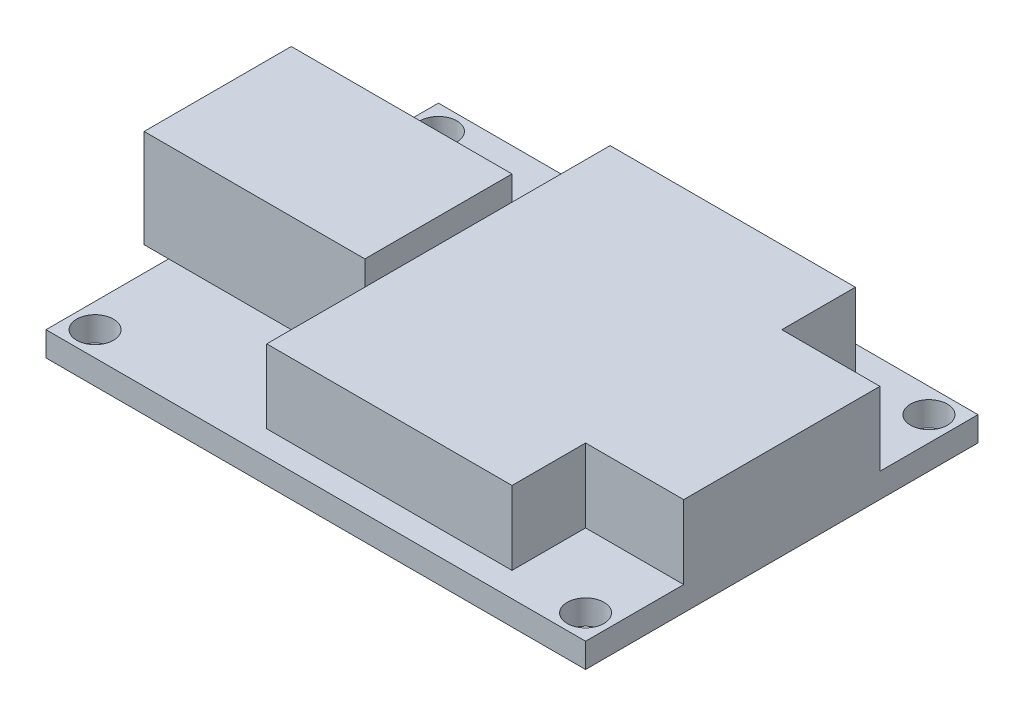
ISO-10303-21;
HEADER;
FILE_DESCRIPTION(('STEP AP214'),'2;1');
FILE_NAME('part.step','',(''),(''),'','','');
FILE_SCHEMA(('AUTOMOTIVE_DESIGN { 1 0 10303 214 1 1 1 1 }'));
ENDSEC;
DATA;
#1=APPLICATION_CONTEXT('core data for automotive mechanical design processes');
#2=APPLICATION_PROTOCOL_DEFINITION('international standard','automotive_design',2000,#1);
#3=PRODUCT_CONTEXT('',#1,'mechanical');
#4=PRODUCT('Part','Part','',(#3));
#5=PRODUCT_RELATED_PRODUCT_CATEGORY('part','',(#4));
#6=PRODUCT_DEFINITION_FORMATION('','',#4);
#7=PRODUCT_DEFINITION_CONTEXT('part definition',#1,'design');
#8=PRODUCT_DEFINITION('design','',#6,#7);
#9=PRODUCT_DEFINITION_SHAPE('','',#8);
#10=(LENGTH_UNIT() NAMED_UNIT(*) SI_UNIT(.MILLI.,.METRE.));
#11=(NAMED_UNIT(*) PLANE_ANGLE_UNIT() SI_UNIT($,.RADIAN.));
#12=(NAMED_UNIT(*) SI_UNIT($,.STERADIAN.) SOLID_ANGLE_UNIT());
#13=UNCERTAINTY_MEASURE_WITH_UNIT(LENGTH_MEASURE(1.E-05),#10,'distance_accuracy_value','');
#14=(GEOMETRIC_REPRESENTATION_CONTEXT(3) GLOBAL_UNCERTAINTY_ASSIGNED_CONTEXT((#13)) GLOBAL_UNIT_ASSIGNED_CONTEXT((#10,
#11,#12)) REPRESENTATION_CONTEXT('',''));
#15=CARTESIAN_POINT('',(0.,0.,0.));
#16=DIRECTION('',(0.,0.,1.));
#17=DIRECTION('',(1.,0.,0.));
#18=AXIS2_PLACEMENT_3D('',#15,#16,#17);
#19=CARTESIAN_POINT('',(0.,1.5875,0.));
#20=DIRECTION('',(0.,1.,0.));
#21=DIRECTION('',(0.,0.,1.));
#22=AXIS2_PLACEMENT_3D('',#19,#20,#21);
#23=PLANE('',#22);
#24=CARTESIAN_POINT('',(15.875,1.5875,11.1125));
#25=DIRECTION('',(0.,1.,0.));
#26=DIRECTION('',(0.,0.,1.));
#27=AXIS2_PLACEMENT_3D('',#24,#25,#26);
#28=CIRCLE('',#27,1.190625);
#29=CARTESIAN_POINT('',(15.875,1.5875,12.303125));
#30=VERTEX_POINT('',#29);
#31=EDGE_CURVE('E373',#30,#30,#28,.T.);
#32=ORIENTED_EDGE('',*,*,#31,.F.);
#33=EDGE_LOOP('',(#32));
#34=FACE_BOUND('',#33,.T.);
#35=CARTESIAN_POINT('',(-15.875,1.5875,11.1125));
#36=DIRECTION('',(0.,1.,0.));
#37=DIRECTION('',(0.,0.,1.));
#38=AXIS2_PLACEMENT_3D('',#35,#36,#37);
#39=CIRCLE('',#38,1.190625);
#40=CARTESIAN_POINT('',(-15.875,1.5875,12.303125));
#41=VERTEX_POINT('',#40);
#42=EDGE_CURVE('E379',#41,#41,#39,.T.);
#43=ORIENTED_EDGE('',*,*,#42,.F.);
#44=EDGE_LOOP('',(#43));
#45=FACE_BOUND('',#44,.T.);
#46=DIRECTION('',(0.,0.,1.));
#47=VECTOR('',#46,1.);
#48=CARTESIAN_POINT('',(-4.76250000000001,1.5875,-11.1125));
#49=LINE('',#48,#47);
#50=CARTESIAN_POINT('',(-4.76250000000001,1.5875,4.7625));
#51=VERTEX_POINT('',#50);
#52=CARTESIAN_POINT('',(-4.7625,1.5875,11.1125));
#53=VERTEX_POINT('',#52);
#54=EDGE_CURVE('E186',#51,#53,#49,.T.);
#55=ORIENTED_EDGE('',*,*,#54,.F.);
#56=DIRECTION('',(1.,0.,0.));
#57=VECTOR('',#56,1.);
#58=CARTESIAN_POINT('',(-19.05,1.5875,4.7625));
#59=LINE('',#58,#57);
#60=CARTESIAN_POINT('',(-17.4625,1.5875,4.7625));
#61=VERTEX_POINT('',#60);
#62=EDGE_CURVE('E322',#61,#51,#59,.T.);
#63=ORIENTED_EDGE('',*,*,#62,.F.);
#64=DIRECTION('',(0.,0.,1.));
#65=VECTOR('',#64,1.);
#66=CARTESIAN_POINT('',(-17.4625,1.5875,-12.7));
#67=LINE('',#66,#65);
#68=CARTESIAN_POINT('',(-17.4625,1.5875,12.7));
#69=VERTEX_POINT('',#68);
#70=EDGE_CURVE('E259',#61,#69,#67,.T.);
#71=ORIENTED_EDGE('',*,*,#70,.T.);
#72=DIRECTION('',(1.,0.,0.));
#73=VECTOR('',#72,1.);
#74=CARTESIAN_POINT('',(-17.4625,1.5875,12.7));
#75=LINE('',#74,#73);
#76=CARTESIAN_POINT('',(17.4625,1.5875,12.7));
#77=VERTEX_POINT('',#76);
#78=EDGE_CURVE('E263',#69,#77,#75,.T.);
#79=ORIENTED_EDGE('',*,*,#78,.T.);
#80=DIRECTION('',(0.,0.,-1.));
#81=VECTOR('',#80,1.);
#82=CARTESIAN_POINT('',(17.4625,1.5875,-12.7));
#83=LINE('',#82,#81);
#84=CARTESIAN_POINT('',(17.4625,1.5875,6.34999999999999));
#85=VERTEX_POINT('',#84);
#86=EDGE_CURVE('E254',#77,#85,#83,.T.);
#87=ORIENTED_EDGE('',*,*,#86,.T.);
#88=DIRECTION('',(1.,0.,0.));
#89=VECTOR('',#88,1.);
#90=CARTESIAN_POINT('',(11.1125,1.5875,6.35));
#91=LINE('',#90,#89);
#92=CARTESIAN_POINT('',(11.1125,1.5875,6.35));
#93=VERTEX_POINT('',#92);
#94=EDGE_CURVE('E221',#93,#85,#91,.T.);
#95=ORIENTED_EDGE('',*,*,#94,.F.);
#96=DIRECTION('',(0.,0.,-1.));
#97=VECTOR('',#96,1.);
#98=CARTESIAN_POINT('',(11.1125,1.5875,6.35));
#99=LINE('',#98,#97);
#100=CARTESIAN_POINT('',(11.1125,1.5875,11.1125));
#101=VERTEX_POINT('',#100);
#102=EDGE_CURVE('E218',#101,#93,#99,.T.);
#103=ORIENTED_EDGE('',*,*,#102,.F.);
#104=DIRECTION('',(1.,0.,0.));
#105=VECTOR('',#104,1.);
#106=CARTESIAN_POINT('',(-4.7625,1.5875,11.1125));
#107=LINE('',#106,#105);
#108=EDGE_CURVE('E215',#53,#101,#107,.T.);
#109=ORIENTED_EDGE('',*,*,#108,.F.);
#110=EDGE_LOOP('',(#55,#63,#71,#79,#87,#95,#103,#109));
#111=FACE_BOUND('',#110,.T.);
#112=ADVANCED_FACE('F36',(#34,#45,#111),#23,.T.);
#113=CARTESIAN_POINT('',(15.875,1.5875,-11.1125));
#114=DIRECTION('',(0.,1.,0.));
#115=DIRECTION('',(0.,0.,1.));
#116=AXIS2_PLACEMENT_3D('',#113,#114,#115);
#117=CIRCLE('',#116,1.190625);
#118=CARTESIAN_POINT('',(15.875,1.5875,-9.921875));
#119=VERTEX_POINT('',#118);
#120=EDGE_CURVE('E367',#119,#119,#117,.T.);
#121=ORIENTED_EDGE('',*,*,#120,.F.);
#122=EDGE_LOOP('',(#121));
#123=FACE_BOUND('',#122,.T.);
#124=CARTESIAN_POINT('',(-15.875,1.5875,-11.1125));
#125=DIRECTION('',(0.,1.,0.));
#126=DIRECTION('',(0.,0.,1.));
#127=AXIS2_PLACEMENT_3D('',#124,#125,#126);
#128=CIRCLE('',#127,1.190625);
#129=CARTESIAN_POINT('',(-15.875,1.5875,-9.921875));
#130=VERTEX_POINT('',#129);
#131=EDGE_CURVE('E361',#130,#130,#128,.T.);
#132=ORIENTED_EDGE('',*,*,#131,.F.);
#133=EDGE_LOOP('',(#132));
#134=FACE_BOUND('',#133,.T.);
#135=CARTESIAN_POINT('',(-17.4625,1.5875,-12.7));
#136=VERTEX_POINT('',#135);
#137=CARTESIAN_POINT('',(-17.4625,1.5875,-4.7625));
#138=VERTEX_POINT('',#137);
#139=EDGE_CURVE('E260',#136,#138,#67,.T.);
#140=ORIENTED_EDGE('',*,*,#139,.T.);
#141=DIRECTION('',(-1.,0.,0.));
#142=VECTOR('',#141,1.);
#143=CARTESIAN_POINT('',(-19.05,1.5875,-4.7625));
#144=LINE('',#143,#142);
#145=CARTESIAN_POINT('',(-4.76250000000001,1.5875,-4.7625));
#146=VERTEX_POINT('',#145);
#147=EDGE_CURVE('E179',#146,#138,#144,.T.);
#148=ORIENTED_EDGE('',*,*,#147,.F.);
#149=CARTESIAN_POINT('',(-4.76250000000001,1.5875,-11.1125));
#150=VERTEX_POINT('',#149);
#151=EDGE_CURVE('E212',#150,#146,#49,.T.);
#152=ORIENTED_EDGE('',*,*,#151,.F.);
#153=DIRECTION('',(-1.,0.,0.));
#154=VECTOR('',#153,1.);
#155=CARTESIAN_POINT('',(-4.76250000000001,1.5875,-11.1125));
#156=LINE('',#155,#154);
#157=CARTESIAN_POINT('',(11.1125,1.5875,-11.1125));
#158=VERTEX_POINT('',#157);
#159=EDGE_CURVE('E227',#158,#150,#156,.T.);
#160=ORIENTED_EDGE('',*,*,#159,.F.);
#161=DIRECTION('',(0.,0.,-1.));
#162=VECTOR('',#161,1.);
#163=CARTESIAN_POINT('',(11.1125,1.5875,-11.1125));
#164=LINE('',#163,#162);
#165=CARTESIAN_POINT('',(11.1125,1.5875,-6.35));
#166=VERTEX_POINT('',#165);
#167=EDGE_CURVE('E59',#166,#158,#164,.T.);
#168=ORIENTED_EDGE('',*,*,#167,.F.);
#169=DIRECTION('',(-1.,0.,0.));
#170=VECTOR('',#169,1.);
#171=CARTESIAN_POINT('',(11.1125,1.5875,-6.35));
#172=LINE('',#171,#170);
#173=CARTESIAN_POINT('',(17.4625,1.5875,-6.35));
#174=VERTEX_POINT('',#173);
#175=EDGE_CURVE('E224',#174,#166,#172,.T.);
#176=ORIENTED_EDGE('',*,*,#175,.F.);
#177=CARTESIAN_POINT('',(17.4625,1.5875,-12.7));
#178=VERTEX_POINT('',#177);
#179=EDGE_CURVE('E257',#174,#178,#83,.T.);
#180=ORIENTED_EDGE('',*,*,#179,.T.);
#181=DIRECTION('',(-1.,0.,0.));
#182=VECTOR('',#181,1.);
#183=CARTESIAN_POINT('',(-17.4625,1.5875,-12.7));
#184=LINE('',#183,#182);
#185=EDGE_CURVE('E256',#178,#136,#184,.T.);
#186=ORIENTED_EDGE('',*,*,#185,.T.);
#187=EDGE_LOOP('',(#140,#148,#152,#160,#168,#176,#180,#186));
#188=FACE_BOUND('',#187,.T.);
#189=ADVANCED_FACE('F328',(#123,#134,#188),#23,.T.);
#190=CARTESIAN_POINT('',(-4.76250000000001,6.35,-11.1125));
#191=DIRECTION('',(1.,0.,0.));
#192=DIRECTION('',(0.,0.,-1.));
#193=AXIS2_PLACEMENT_3D('',#190,#191,#192);
#194=PLANE('',#193);
#195=DIRECTION('',(0.,-1.,0.));
#196=VECTOR('',#195,1.);
#197=CARTESIAN_POINT('',(-4.76250000000001,7.9375,4.7625));
#198=LINE('',#197,#196);
#199=CARTESIAN_POINT('',(-4.7625,6.35,4.7625));
#200=VERTEX_POINT('',#199);
#201=EDGE_CURVE('E188',#200,#51,#198,.T.);
#202=ORIENTED_EDGE('',*,*,#201,.T.);
#203=ORIENTED_EDGE('',*,*,#54,.T.);
#204=DIRECTION('',(0.,-1.,0.));
#205=VECTOR('',#204,1.);
#206=CARTESIAN_POINT('',(-4.7625,6.35,11.1125));
#207=LINE('',#206,#205);
#208=CARTESIAN_POINT('',(-4.7625,6.35,11.1125));
#209=VERTEX_POINT('',#208);
#210=EDGE_CURVE('E250',#209,#53,#207,.T.);
#211=ORIENTED_EDGE('',*,*,#210,.F.);
#212=DIRECTION('',(0.,0.,1.));
#213=VECTOR('',#212,1.);
#214=CARTESIAN_POINT('',(-4.76250000000001,6.35,-11.1125));
#215=LINE('',#214,#213);
#216=EDGE_CURVE('E197',#200,#209,#215,.T.);
#217=ORIENTED_EDGE('',*,*,#216,.F.);
#218=EDGE_LOOP('',(#202,#203,#211,#217));
#219=FACE_BOUND('',#218,.T.);
#220=ADVANCED_FACE('F319',(#219),#194,.F.);
#221=DIRECTION('',(0.,-1.,0.));
#222=VECTOR('',#221,1.);
#223=CARTESIAN_POINT('',(-4.76250000000001,7.9375,-4.7625));
#224=LINE('',#223,#222);
#225=CARTESIAN_POINT('',(-4.76250000000001,6.35,-4.7625));
#226=VERTEX_POINT('',#225);
#227=EDGE_CURVE('E349',#226,#146,#224,.T.);
#228=ORIENTED_EDGE('',*,*,#227,.F.);
#229=CARTESIAN_POINT('',(-4.76250000000001,6.35,-11.1125));
#230=VERTEX_POINT('',#229);
#231=EDGE_CURVE('E192',#230,#226,#215,.T.);
#232=ORIENTED_EDGE('',*,*,#231,.F.);
#233=DIRECTION('',(0.,-1.,0.));
#234=VECTOR('',#233,1.);
#235=CARTESIAN_POINT('',(-4.76250000000001,6.35,-11.1125));
#236=LINE('',#235,#234);
#237=EDGE_CURVE('E211',#230,#150,#236,.T.);
#238=ORIENTED_EDGE('',*,*,#237,.T.);
#239=ORIENTED_EDGE('',*,*,#151,.T.);
#240=EDGE_LOOP('',(#228,#232,#238,#239));
#241=FACE_BOUND('',#240,.T.);
#242=ADVANCED_FACE('F351',(#241),#194,.F.);
#243=CARTESIAN_POINT('',(17.4625,1.5875,-12.7));
#244=DIRECTION('',(-1.,0.,0.));
#245=DIRECTION('',(0.,0.,1.));
#246=AXIS2_PLACEMENT_3D('',#243,#244,#245);
#247=PLANE('',#246);
#248=DIRECTION('',(0.,0.,-1.));
#249=VECTOR('',#248,1.);
#250=CARTESIAN_POINT('',(17.4625,0.,-12.7));
#251=LINE('',#250,#249);
#252=CARTESIAN_POINT('',(17.4625,0.,12.7));
#253=VERTEX_POINT('',#252);
#254=CARTESIAN_POINT('',(17.4625,0.,-12.7));
#255=VERTEX_POINT('',#254);
#256=EDGE_CURVE('E253',#253,#255,#251,.T.);
#257=ORIENTED_EDGE('',*,*,#256,.T.);
#258=DIRECTION('',(0.,-1.,0.));
#259=VECTOR('',#258,1.);
#260=CARTESIAN_POINT('',(17.4625,1.5875,-12.7));
#261=LINE('',#260,#259);
#262=EDGE_CURVE('E11',#178,#255,#261,.T.);
#263=ORIENTED_EDGE('',*,*,#262,.F.);
#264=ORIENTED_EDGE('',*,*,#179,.F.);
#265=DIRECTION('',(0.,-1.,0.));
#266=VECTOR('',#265,1.);
#267=CARTESIAN_POINT('',(17.4625,6.35,-6.35));
#268=LINE('',#267,#266);
#269=CARTESIAN_POINT('',(17.4625,6.35,-6.35));
#270=VERTEX_POINT('',#269);
#271=EDGE_CURVE('E238',#270,#174,#268,.T.);
#272=ORIENTED_EDGE('',*,*,#271,.F.);
#273=DIRECTION('',(0.,0.,-1.));
#274=VECTOR('',#273,1.);
#275=CARTESIAN_POINT('',(17.4625,6.35,-6.35));
#276=LINE('',#275,#274);
#277=CARTESIAN_POINT('',(17.4625,6.35,6.35));
#278=VERTEX_POINT('',#277);
#279=EDGE_CURVE('E203',#278,#270,#276,.T.);
#280=ORIENTED_EDGE('',*,*,#279,.F.);
#281=DIRECTION('',(0.,-1.,0.));
#282=VECTOR('',#281,1.);
#283=CARTESIAN_POINT('',(17.4625,6.35,6.35));
#284=LINE('',#283,#282);
#285=EDGE_CURVE('E241',#278,#85,#284,.T.);
#286=ORIENTED_EDGE('',*,*,#285,.T.);
#287=ORIENTED_EDGE('',*,*,#86,.F.);
#288=DIRECTION('',(0.,-1.,0.));
#289=VECTOR('',#288,1.);
#290=CARTESIAN_POINT('',(17.4625,1.5875,12.7));
#291=LINE('',#290,#289);
#292=EDGE_CURVE('E265',#77,#253,#291,.T.);
#293=ORIENTED_EDGE('',*,*,#292,.T.);
#294=EDGE_LOOP('',(#257,#263,#264,#272,#280,#286,#287,#293));
#295=FACE_BOUND('',#294,.T.);
#296=ADVANCED_FACE('F38',(#295),#247,.F.);
#297=CARTESIAN_POINT('',(-17.4625,1.5875,-12.7));
#298=DIRECTION('',(0.,0.,1.));
#299=DIRECTION('',(1.,0.,0.));
#300=AXIS2_PLACEMENT_3D('',#297,#298,#299);
#301=PLANE('',#300);
#302=DIRECTION('',(-1.,0.,0.));
#303=VECTOR('',#302,1.);
#304=CARTESIAN_POINT('',(-17.4625,0.,-12.7));
#305=LINE('',#304,#303);
#306=CARTESIAN_POINT('',(-17.4625,0.,-12.7));
#307=VERTEX_POINT('',#306);
#308=EDGE_CURVE('E268',#255,#307,#305,.T.);
#309=ORIENTED_EDGE('',*,*,#308,.T.);
#310=DIRECTION('',(0.,-1.,0.));
#311=VECTOR('',#310,1.);
#312=CARTESIAN_POINT('',(-17.4625,1.5875,-12.7));
#313=LINE('',#312,#311);
#314=EDGE_CURVE('E44',#136,#307,#313,.T.);
#315=ORIENTED_EDGE('',*,*,#314,.F.);
#316=ORIENTED_EDGE('',*,*,#185,.F.);
#317=ORIENTED_EDGE('',*,*,#262,.T.);
#318=EDGE_LOOP('',(#309,#315,#316,#317));
#319=FACE_BOUND('',#318,.T.);
#320=ADVANCED_FACE('F331',(#319),#301,.F.);
#321=CARTESIAN_POINT('',(-17.4625,1.5875,-12.7));
#322=DIRECTION('',(1.,0.,0.));
#323=DIRECTION('',(0.,0.,-1.));
#324=AXIS2_PLACEMENT_3D('',#321,#322,#323);
#325=PLANE('',#324);
#326=DIRECTION('',(0.,0.,1.));
#327=VECTOR('',#326,1.);
#328=CARTESIAN_POINT('',(-17.4625,0.,-12.7));
#329=LINE('',#328,#327);
#330=CARTESIAN_POINT('',(-17.4625,0.,12.7));
#331=VERTEX_POINT('',#330);
#332=EDGE_CURVE('E270',#307,#331,#329,.T.);
#333=ORIENTED_EDGE('',*,*,#332,.T.);
#334=DIRECTION('',(0.,-1.,0.));
#335=VECTOR('',#334,1.);
#336=CARTESIAN_POINT('',(-17.4625,1.5875,12.7));
#337=LINE('',#336,#335);
#338=EDGE_CURVE('E276',#69,#331,#337,.T.);
#339=ORIENTED_EDGE('',*,*,#338,.F.);
#340=ORIENTED_EDGE('',*,*,#70,.F.);
#341=DIRECTION('',(0.,0.,1.));
#342=VECTOR('',#341,1.);
#343=CARTESIAN_POINT('',(-17.4625,1.5875,-12.7));
#344=LINE('',#343,#342);
#345=EDGE_CURVE('E184',#138,#61,#344,.T.);
#346=ORIENTED_EDGE('',*,*,#345,.F.);
#347=ORIENTED_EDGE('',*,*,#139,.F.);
#348=ORIENTED_EDGE('',*,*,#314,.T.);
#349=EDGE_LOOP('',(#333,#339,#340,#346,#347,#348));
#350=FACE_BOUND('',#349,.T.);
#351=ADVANCED_FACE('F283',(#350),#325,.F.);
#352=CARTESIAN_POINT('',(-17.4625,1.5875,12.7));
#353=DIRECTION('',(0.,0.,-1.));
#354=DIRECTION('',(-1.,0.,0.));
#355=AXIS2_PLACEMENT_3D('',#352,#353,#354);
#356=PLANE('',#355);
#357=DIRECTION('',(1.,0.,0.));
#358=VECTOR('',#357,1.);
#359=CARTESIAN_POINT('',(-17.4625,0.,12.7));
#360=LINE('',#359,#358);
#361=EDGE_CURVE('E272',#331,#253,#360,.T.);
#362=ORIENTED_EDGE('',*,*,#361,.T.);
#363=ORIENTED_EDGE('',*,*,#292,.F.);
#364=ORIENTED_EDGE('',*,*,#78,.F.);
#365=ORIENTED_EDGE('',*,*,#338,.T.);
#366=EDGE_LOOP('',(#362,#363,#364,#365));
#367=FACE_BOUND('',#366,.T.);
#368=ADVANCED_FACE('F294',(#367),#356,.F.);
#369=CARTESIAN_POINT('',(0.,0.,0.));
#370=DIRECTION('',(0.,1.,0.));
#371=DIRECTION('',(0.,0.,1.));
#372=AXIS2_PLACEMENT_3D('',#369,#370,#371);
#373=PLANE('',#372);
#374=CARTESIAN_POINT('',(15.875,0.,-11.1125));
#375=DIRECTION('',(0.,1.,0.));
#376=DIRECTION('',(0.,0.,1.));
#377=AXIS2_PLACEMENT_3D('',#374,#375,#376);
#378=CIRCLE('',#377,1.190625);
#379=CARTESIAN_POINT('',(15.875,0.,-9.921875));
#380=VERTEX_POINT('',#379);
#381=EDGE_CURVE('E370',#380,#380,#378,.T.);
#382=ORIENTED_EDGE('',*,*,#381,.T.);
#383=EDGE_LOOP('',(#382));
#384=FACE_BOUND('',#383,.T.);
#385=CARTESIAN_POINT('',(15.875,0.,11.1125));
#386=DIRECTION('',(0.,1.,0.));
#387=DIRECTION('',(0.,0.,1.));
#388=AXIS2_PLACEMENT_3D('',#385,#386,#387);
#389=CIRCLE('',#388,1.190625);
#390=CARTESIAN_POINT('',(15.875,0.,12.303125));
#391=VERTEX_POINT('',#390);
#392=EDGE_CURVE('E376',#391,#391,#389,.T.);
#393=ORIENTED_EDGE('',*,*,#392,.T.);
#394=EDGE_LOOP('',(#393));
#395=FACE_BOUND('',#394,.T.);
#396=CARTESIAN_POINT('',(-15.875,0.,11.1125));
#397=DIRECTION('',(0.,1.,0.));
#398=DIRECTION('',(0.,0.,1.));
#399=AXIS2_PLACEMENT_3D('',#396,#397,#398);
#400=CIRCLE('',#399,1.190625);
#401=CARTESIAN_POINT('',(-15.875,0.,12.303125));
#402=VERTEX_POINT('',#401);
#403=EDGE_CURVE('E364',#402,#402,#400,.T.);
#404=ORIENTED_EDGE('',*,*,#403,.T.);
#405=EDGE_LOOP('',(#404));
#406=FACE_BOUND('',#405,.T.);
#407=CARTESIAN_POINT('',(-15.875,0.,-11.1125));
#408=DIRECTION('',(0.,1.,0.));
#409=DIRECTION('',(0.,0.,1.));
#410=AXIS2_PLACEMENT_3D('',#407,#408,#409);
#411=CIRCLE('',#410,1.190625);
#412=CARTESIAN_POINT('',(-15.875,0.,-9.921875));
#413=VERTEX_POINT('',#412);
#414=EDGE_CURVE('E358',#413,#413,#411,.T.);
#415=ORIENTED_EDGE('',*,*,#414,.T.);
#416=EDGE_LOOP('',(#415));
#417=FACE_BOUND('',#416,.T.);
#418=ORIENTED_EDGE('',*,*,#256,.F.);
#419=ORIENTED_EDGE('',*,*,#361,.F.);
#420=ORIENTED_EDGE('',*,*,#332,.F.);
#421=ORIENTED_EDGE('',*,*,#308,.F.);
#422=EDGE_LOOP('',(#418,#419,#420,#421));
#423=FACE_BOUND('',#422,.T.);
#424=ADVANCED_FACE('F291',(#384,#395,#406,#417,#423),#373,.F.);
#425=CARTESIAN_POINT('',(-4.7625,6.35,11.1125));
#426=DIRECTION('',(0.,0.,-1.));
#427=DIRECTION('',(-1.,0.,0.));
#428=AXIS2_PLACEMENT_3D('',#425,#426,#427);
#429=PLANE('',#428);
#430=ORIENTED_EDGE('',*,*,#108,.T.);
#431=DIRECTION('',(0.,-1.,0.));
#432=VECTOR('',#431,1.);
#433=CARTESIAN_POINT('',(11.1125,6.35,11.1125));
#434=LINE('',#433,#432);
#435=CARTESIAN_POINT('',(11.1125,6.35,11.1125));
#436=VERTEX_POINT('',#435);
#437=EDGE_CURVE('E247',#436,#101,#434,.T.);
#438=ORIENTED_EDGE('',*,*,#437,.F.);
#439=DIRECTION('',(1.,0.,0.));
#440=VECTOR('',#439,1.);
#441=CARTESIAN_POINT('',(-4.7625,6.35,11.1125));
#442=LINE('',#441,#440);
#443=EDGE_CURVE('E195',#209,#436,#442,.T.);
#444=ORIENTED_EDGE('',*,*,#443,.F.);
#445=ORIENTED_EDGE('',*,*,#210,.T.);
#446=EDGE_LOOP('',(#430,#438,#444,#445));
#447=FACE_BOUND('',#446,.T.);
#448=ADVANCED_FACE('F313',(#447),#429,.F.);
#449=CARTESIAN_POINT('',(11.1125,6.35,6.35));
#450=DIRECTION('',(-1.,0.,0.));
#451=DIRECTION('',(0.,0.,1.));
#452=AXIS2_PLACEMENT_3D('',#449,#450,#451);
#453=PLANE('',#452);
#454=ORIENTED_EDGE('',*,*,#102,.T.);
#455=DIRECTION('',(0.,-1.,0.));
#456=VECTOR('',#455,1.);
#457=CARTESIAN_POINT('',(11.1125,6.35,6.35));
#458=LINE('',#457,#456);
#459=CARTESIAN_POINT('',(11.1125,6.35,6.35));
#460=VERTEX_POINT('',#459);
#461=EDGE_CURVE('E244',#460,#93,#458,.T.);
#462=ORIENTED_EDGE('',*,*,#461,.F.);
#463=DIRECTION('',(0.,0.,-1.));
#464=VECTOR('',#463,1.);
#465=CARTESIAN_POINT('',(11.1125,6.35,6.35));
#466=LINE('',#465,#464);
#467=EDGE_CURVE('E199',#436,#460,#466,.T.);
#468=ORIENTED_EDGE('',*,*,#467,.F.);
#469=ORIENTED_EDGE('',*,*,#437,.T.);
#470=EDGE_LOOP('',(#454,#462,#468,#469));
#471=FACE_BOUND('',#470,.T.);
#472=ADVANCED_FACE('F309',(#471),#453,.F.);
#473=CARTESIAN_POINT('',(11.1125,6.35,6.35));
#474=DIRECTION('',(0.,0.,-1.));
#475=DIRECTION('',(-1.,0.,0.));
#476=AXIS2_PLACEMENT_3D('',#473,#474,#475);
#477=PLANE('',#476);
#478=ORIENTED_EDGE('',*,*,#94,.T.);
#479=ORIENTED_EDGE('',*,*,#285,.F.);
#480=DIRECTION('',(1.,0.,0.));
#481=VECTOR('',#480,1.);
#482=CARTESIAN_POINT('',(11.1125,6.35,6.35));
#483=LINE('',#482,#481);
#484=EDGE_CURVE('E201',#460,#278,#483,.T.);
#485=ORIENTED_EDGE('',*,*,#484,.F.);
#486=ORIENTED_EDGE('',*,*,#461,.T.);
#487=EDGE_LOOP('',(#478,#479,#485,#486));
#488=FACE_BOUND('',#487,.T.);
#489=ADVANCED_FACE('F304',(#488),#477,.F.);
#490=CARTESIAN_POINT('',(11.1125,6.35,-6.35));
#491=DIRECTION('',(0.,0.,1.));
#492=DIRECTION('',(1.,0.,0.));
#493=AXIS2_PLACEMENT_3D('',#490,#491,#492);
#494=PLANE('',#493);
#495=ORIENTED_EDGE('',*,*,#175,.T.);
#496=DIRECTION('',(0.,-1.,0.));
#497=VECTOR('',#496,1.);
#498=CARTESIAN_POINT('',(11.1125,6.35,-6.35));
#499=LINE('',#498,#497);
#500=CARTESIAN_POINT('',(11.1125,6.35,-6.35));
#501=VERTEX_POINT('',#500);
#502=EDGE_CURVE('E235',#501,#166,#499,.T.);
#503=ORIENTED_EDGE('',*,*,#502,.F.);
#504=DIRECTION('',(-1.,0.,0.));
#505=VECTOR('',#504,1.);
#506=CARTESIAN_POINT('',(11.1125,6.35,-6.35));
#507=LINE('',#506,#505);
#508=EDGE_CURVE('E205',#270,#501,#507,.T.);
#509=ORIENTED_EDGE('',*,*,#508,.F.);
#510=ORIENTED_EDGE('',*,*,#271,.T.);
#511=EDGE_LOOP('',(#495,#503,#509,#510));
#512=FACE_BOUND('',#511,.T.);
#513=ADVANCED_FACE('F335',(#512),#494,.F.);
#514=CARTESIAN_POINT('',(11.1125,6.35,-11.1125));
#515=DIRECTION('',(-1.,0.,0.));
#516=DIRECTION('',(0.,0.,1.));
#517=AXIS2_PLACEMENT_3D('',#514,#515,#516);
#518=PLANE('',#517);
#519=ORIENTED_EDGE('',*,*,#167,.T.);
#520=DIRECTION('',(0.,-1.,0.));
#521=VECTOR('',#520,1.);
#522=CARTESIAN_POINT('',(11.1125,6.35,-11.1125));
#523=LINE('',#522,#521);
#524=CARTESIAN_POINT('',(11.1125,6.35,-11.1125));
#525=VERTEX_POINT('',#524);
#526=EDGE_CURVE('E232',#525,#158,#523,.T.);
#527=ORIENTED_EDGE('',*,*,#526,.F.);
#528=DIRECTION('',(0.,0.,-1.));
#529=VECTOR('',#528,1.);
#530=CARTESIAN_POINT('',(11.1125,6.35,-11.1125));
#531=LINE('',#530,#529);
#532=EDGE_CURVE('E207',#501,#525,#531,.T.);
#533=ORIENTED_EDGE('',*,*,#532,.F.);
#534=ORIENTED_EDGE('',*,*,#502,.T.);
#535=EDGE_LOOP('',(#519,#527,#533,#534));
#536=FACE_BOUND('',#535,.T.);
#537=ADVANCED_FACE('F501',(#536),#518,.F.);
#538=CARTESIAN_POINT('',(-4.76250000000001,6.35,-11.1125));
#539=DIRECTION('',(0.,0.,1.));
#540=DIRECTION('',(1.,0.,0.));
#541=AXIS2_PLACEMENT_3D('',#538,#539,#540);
#542=PLANE('',#541);
#543=ORIENTED_EDGE('',*,*,#159,.T.);
#544=ORIENTED_EDGE('',*,*,#237,.F.);
#545=DIRECTION('',(-1.,0.,0.));
#546=VECTOR('',#545,1.);
#547=CARTESIAN_POINT('',(-4.76250000000001,6.35,-11.1125));
#548=LINE('',#547,#546);
#549=EDGE_CURVE('E209',#525,#230,#548,.T.);
#550=ORIENTED_EDGE('',*,*,#549,.F.);
#551=ORIENTED_EDGE('',*,*,#526,.T.);
#552=EDGE_LOOP('',(#543,#544,#550,#551));
#553=FACE_BOUND('',#552,.T.);
#554=ADVANCED_FACE('F498',(#553),#542,.F.);
#555=CARTESIAN_POINT('',(0.,6.35,0.));
#556=DIRECTION('',(0.,1.,0.));
#557=DIRECTION('',(0.,0.,1.));
#558=AXIS2_PLACEMENT_3D('',#555,#556,#557);
#559=PLANE('',#558);
#560=ORIENTED_EDGE('',*,*,#231,.T.);
#561=EDGE_CURVE('E196',#226,#200,#215,.T.);
#562=ORIENTED_EDGE('',*,*,#561,.T.);
#563=ORIENTED_EDGE('',*,*,#216,.T.);
#564=ORIENTED_EDGE('',*,*,#443,.T.);
#565=ORIENTED_EDGE('',*,*,#467,.T.);
#566=ORIENTED_EDGE('',*,*,#484,.T.);
#567=ORIENTED_EDGE('',*,*,#279,.T.);
#568=ORIENTED_EDGE('',*,*,#508,.T.);
#569=ORIENTED_EDGE('',*,*,#532,.T.);
#570=ORIENTED_EDGE('',*,*,#549,.T.);
#571=EDGE_LOOP('',(#560,#562,#563,#564,#565,#566,#567,#568,#569,#570));
#572=FACE_BOUND('',#571,.T.);
#573=ADVANCED_FACE('F339',(#572),#559,.T.);
#574=CARTESIAN_POINT('',(0.,1.5875,0.));
#575=DIRECTION('',(0.,1.,0.));
#576=DIRECTION('',(0.,0.,1.));
#577=AXIS2_PLACEMENT_3D('',#574,#575,#576);
#578=PLANE('',#577);
#579=CARTESIAN_POINT('',(-19.05,1.5875,-4.7625));
#580=VERTEX_POINT('',#579);
#581=EDGE_CURVE('E355',#138,#580,#144,.T.);
#582=ORIENTED_EDGE('',*,*,#581,.F.);
#583=ORIENTED_EDGE('',*,*,#345,.T.);
#584=CARTESIAN_POINT('',(-19.05,1.5875,4.7625));
#585=VERTEX_POINT('',#584);
#586=EDGE_CURVE('E324',#585,#61,#59,.T.);
#587=ORIENTED_EDGE('',*,*,#586,.F.);
#588=DIRECTION('',(0.,0.,1.));
#589=VECTOR('',#588,1.);
#590=CARTESIAN_POINT('',(-19.05,1.5875,-4.7625));
#591=LINE('',#590,#589);
#592=EDGE_CURVE('E183',#580,#585,#591,.T.);
#593=ORIENTED_EDGE('',*,*,#592,.F.);
#594=EDGE_LOOP('',(#582,#583,#587,#593));
#595=FACE_BOUND('',#594,.T.);
#596=ADVANCED_FACE('F485',(#595),#578,.F.);
#597=CARTESIAN_POINT('',(-19.05,7.9375,-4.7625));
#598=DIRECTION('',(1.,0.,0.));
#599=DIRECTION('',(0.,0.,-1.));
#600=AXIS2_PLACEMENT_3D('',#597,#598,#599);
#601=PLANE('',#600);
#602=ORIENTED_EDGE('',*,*,#592,.T.);
#603=DIRECTION('',(0.,-1.,0.));
#604=VECTOR('',#603,1.);
#605=CARTESIAN_POINT('',(-19.05,7.9375,4.7625));
#606=LINE('',#605,#604);
#607=CARTESIAN_POINT('',(-19.05,7.9375,4.7625));
#608=VERTEX_POINT('',#607);
#609=EDGE_CURVE('E166',#608,#585,#606,.T.);
#610=ORIENTED_EDGE('',*,*,#609,.F.);
#611=DIRECTION('',(0.,0.,1.));
#612=VECTOR('',#611,1.);
#613=CARTESIAN_POINT('',(-19.05,7.9375,-4.7625));
#614=LINE('',#613,#612);
#615=CARTESIAN_POINT('',(-19.05,7.9375,-4.7625));
#616=VERTEX_POINT('',#615);
#617=EDGE_CURVE('E170',#616,#608,#614,.T.);
#618=ORIENTED_EDGE('',*,*,#617,.F.);
#619=DIRECTION('',(0.,-1.,0.));
#620=VECTOR('',#619,1.);
#621=CARTESIAN_POINT('',(-19.05,7.9375,-4.7625));
#622=LINE('',#621,#620);
#623=EDGE_CURVE('E352',#616,#580,#622,.T.);
#624=ORIENTED_EDGE('',*,*,#623,.T.);
#625=EDGE_LOOP('',(#602,#610,#618,#624));
#626=FACE_BOUND('',#625,.T.);
#627=ADVANCED_FACE('F181',(#626),#601,.F.);
#628=CARTESIAN_POINT('',(-19.05,7.9375,4.7625));
#629=DIRECTION('',(0.,0.,-1.));
#630=DIRECTION('',(-1.,0.,0.));
#631=AXIS2_PLACEMENT_3D('',#628,#629,#630);
#632=PLANE('',#631);
#633=ORIENTED_EDGE('',*,*,#586,.T.);
#634=ORIENTED_EDGE('',*,*,#62,.T.);
#635=ORIENTED_EDGE('',*,*,#201,.F.);
#636=CARTESIAN_POINT('',(-4.76250000000001,7.9375,4.7625));
#637=VERTEX_POINT('',#636);
#638=EDGE_CURVE('E51',#637,#200,#198,.T.);
#639=ORIENTED_EDGE('',*,*,#638,.F.);
#640=DIRECTION('',(1.,0.,0.));
#641=VECTOR('',#640,1.);
#642=CARTESIAN_POINT('',(-19.05,7.9375,4.7625));
#643=LINE('',#642,#641);
#644=EDGE_CURVE('E161',#608,#637,#643,.T.);
#645=ORIENTED_EDGE('',*,*,#644,.F.);
#646=ORIENTED_EDGE('',*,*,#609,.T.);
#647=EDGE_LOOP('',(#633,#634,#635,#639,#645,#646));
#648=FACE_BOUND('',#647,.T.);
#649=ADVANCED_FACE('F164',(#648),#632,.F.);
#650=CARTESIAN_POINT('',(-4.76250000000001,7.9375,-4.7625));
#651=DIRECTION('',(-1.,0.,0.));
#652=DIRECTION('',(0.,0.,1.));
#653=AXIS2_PLACEMENT_3D('',#650,#651,#652);
#654=PLANE('',#653);
#655=ORIENTED_EDGE('',*,*,#561,.F.);
#656=CARTESIAN_POINT('',(-4.76250000000001,7.9375,-4.7625));
#657=VERTEX_POINT('',#656);
#658=EDGE_CURVE('E345',#657,#226,#224,.T.);
#659=ORIENTED_EDGE('',*,*,#658,.F.);
#660=DIRECTION('',(0.,0.,-1.));
#661=VECTOR('',#660,1.);
#662=CARTESIAN_POINT('',(-4.76250000000001,7.9375,-4.7625));
#663=LINE('',#662,#661);
#664=EDGE_CURVE('E169',#637,#657,#663,.T.);
#665=ORIENTED_EDGE('',*,*,#664,.F.);
#666=ORIENTED_EDGE('',*,*,#638,.T.);
#667=EDGE_LOOP('',(#655,#659,#665,#666));
#668=FACE_BOUND('',#667,.T.);
#669=ADVANCED_FACE('F344',(#668),#654,.F.);
#670=CARTESIAN_POINT('',(-19.05,7.9375,-4.7625));
#671=DIRECTION('',(0.,0.,1.));
#672=DIRECTION('',(1.,0.,0.));
#673=AXIS2_PLACEMENT_3D('',#670,#671,#672);
#674=PLANE('',#673);
#675=ORIENTED_EDGE('',*,*,#147,.T.);
#676=ORIENTED_EDGE('',*,*,#581,.T.);
#677=ORIENTED_EDGE('',*,*,#623,.F.);
#678=DIRECTION('',(-1.,0.,0.));
#679=VECTOR('',#678,1.);
#680=CARTESIAN_POINT('',(-19.05,7.9375,-4.7625));
#681=LINE('',#680,#679);
#682=EDGE_CURVE('E175',#657,#616,#681,.T.);
#683=ORIENTED_EDGE('',*,*,#682,.F.);
#684=ORIENTED_EDGE('',*,*,#658,.T.);
#685=ORIENTED_EDGE('',*,*,#227,.T.);
#686=EDGE_LOOP('',(#675,#676,#677,#683,#684,#685));
#687=FACE_BOUND('',#686,.T.);
#688=ADVANCED_FACE('F348',(#687),#674,.F.);
#689=CARTESIAN_POINT('',(0.,7.9375,0.));
#690=DIRECTION('',(0.,1.,0.));
#691=DIRECTION('',(0.,0.,1.));
#692=AXIS2_PLACEMENT_3D('',#689,#690,#691);
#693=PLANE('',#692);
#694=ORIENTED_EDGE('',*,*,#617,.T.);
#695=ORIENTED_EDGE('',*,*,#644,.T.);
#696=ORIENTED_EDGE('',*,*,#664,.T.);
#697=ORIENTED_EDGE('',*,*,#682,.T.);
#698=EDGE_LOOP('',(#694,#695,#696,#697));
#699=FACE_BOUND('',#698,.T.);
#700=ADVANCED_FACE('F173',(#699),#693,.T.);
#701=CARTESIAN_POINT('',(-15.875,0.,-11.1125));
#702=DIRECTION('',(0.,1.,0.));
#703=DIRECTION('',(0.,0.,1.));
#704=AXIS2_PLACEMENT_3D('',#701,#702,#703);
#705=CYLINDRICAL_SURFACE('',#704,1.190625);
#706=ORIENTED_EDGE('',*,*,#414,.F.);
#707=EDGE_LOOP('',(#706));
#708=FACE_BOUND('',#707,.T.);
#709=ORIENTED_EDGE('',*,*,#131,.T.);
#710=EDGE_LOOP('',(#709));
#711=FACE_BOUND('',#710,.T.);
#712=ADVANCED_FACE('F391',(#708,#711),#705,.F.);
#713=CARTESIAN_POINT('',(-15.875,0.,11.1125));
#714=DIRECTION('',(0.,1.,0.));
#715=DIRECTION('',(0.,0.,1.));
#716=AXIS2_PLACEMENT_3D('',#713,#714,#715);
#717=CYLINDRICAL_SURFACE('',#716,1.190625);
#718=ORIENTED_EDGE('',*,*,#403,.F.);
#719=EDGE_LOOP('',(#718));
#720=FACE_BOUND('',#719,.T.);
#721=ORIENTED_EDGE('',*,*,#42,.T.);
#722=EDGE_LOOP('',(#721));
#723=FACE_BOUND('',#722,.T.);
#724=ADVANCED_FACE('F387',(#720,#723),#717,.F.);
#725=CARTESIAN_POINT('',(15.875,0.,11.1125));
#726=DIRECTION('',(0.,1.,0.));
#727=DIRECTION('',(0.,0.,1.));
#728=AXIS2_PLACEMENT_3D('',#725,#726,#727);
#729=CYLINDRICAL_SURFACE('',#728,1.190625);
#730=ORIENTED_EDGE('',*,*,#392,.F.);
#731=EDGE_LOOP('',(#730));
#732=FACE_BOUND('',#731,.T.);
#733=ORIENTED_EDGE('',*,*,#31,.T.);
#734=EDGE_LOOP('',(#733));
#735=FACE_BOUND('',#734,.T.);
#736=ADVANCED_FACE('F390',(#732,#735),#729,.F.);
#737=CARTESIAN_POINT('',(15.875,0.,-11.1125));
#738=DIRECTION('',(0.,1.,0.));
#739=DIRECTION('',(0.,0.,1.));
#740=AXIS2_PLACEMENT_3D('',#737,#738,#739);
#741=CYLINDRICAL_SURFACE('',#740,1.190625);
#742=ORIENTED_EDGE('',*,*,#381,.F.);
#743=EDGE_LOOP('',(#742));
#744=FACE_BOUND('',#743,.T.);
#745=ORIENTED_EDGE('',*,*,#120,.T.);
#746=EDGE_LOOP('',(#745));
#747=FACE_BOUND('',#746,.T.);
#748=ADVANCED_FACE('F467',(#744,#747),#741,.F.);
#749=CLOSED_SHELL('',(#112,#189,#220,#242,#296,#320,#351,#368,#424,#448,#472,#489,#513,#537,
#554,#573,#596,#627,#649,#669,#688,#700,#712,#724,#736,#748));
#750=MANIFOLD_SOLID_BREP('B2',#749);
#751=ADVANCED_BREP_SHAPE_REPRESENTATION('',(#18,#750),#14);
#752=SHAPE_DEFINITION_REPRESENTATION(#9,#751);
ENDSEC;
END-ISO-10303-21;
